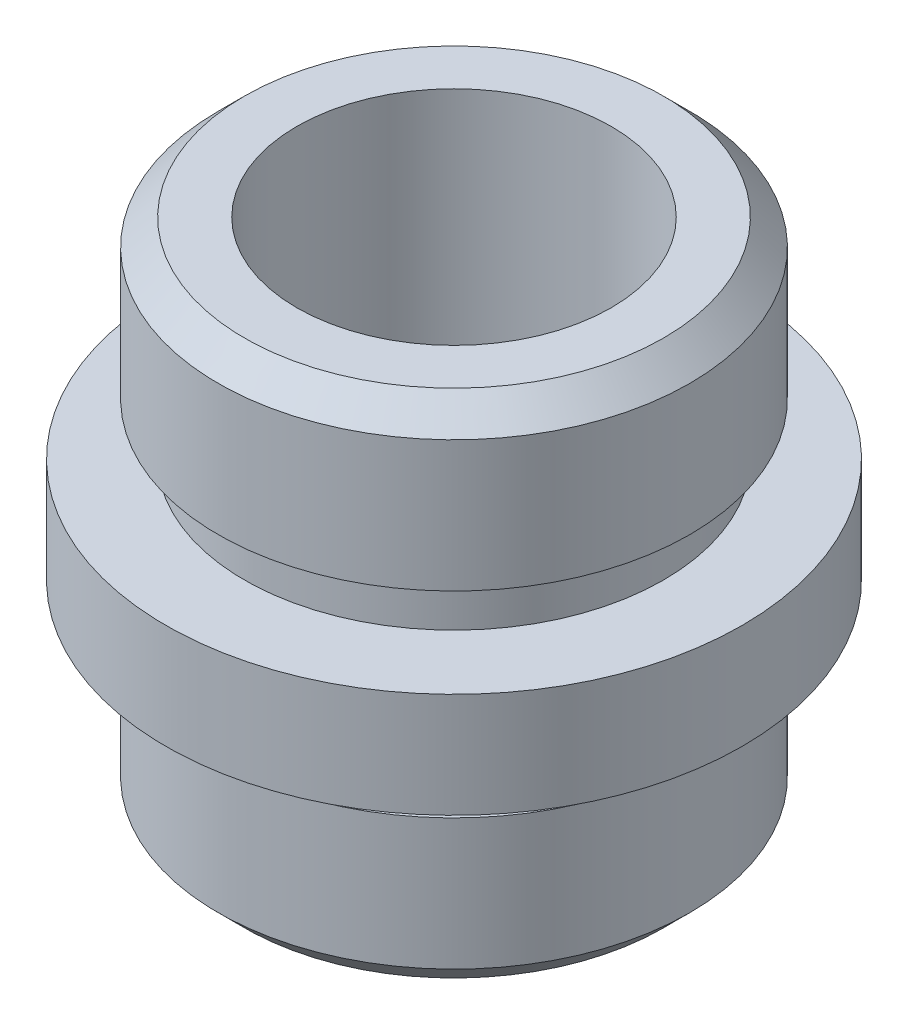
ISO-10303-21;
HEADER;
FILE_DESCRIPTION(('STEP AP214'),'2;1');
FILE_NAME('part.step','',(''),(''),'','','');
FILE_SCHEMA(('AUTOMOTIVE_DESIGN { 1 0 10303 214 1 1 1 1 }'));
ENDSEC;
DATA;
#1=APPLICATION_CONTEXT('core data for automotive mechanical design processes');
#2=APPLICATION_PROTOCOL_DEFINITION('international standard','automotive_design',2000,#1);
#3=PRODUCT_CONTEXT('',#1,'mechanical');
#4=PRODUCT('Part','Part','',(#3));
#5=PRODUCT_RELATED_PRODUCT_CATEGORY('part','',(#4));
#6=PRODUCT_DEFINITION_FORMATION('','',#4);
#7=PRODUCT_DEFINITION_CONTEXT('part definition',#1,'design');
#8=PRODUCT_DEFINITION('design','',#6,#7);
#9=PRODUCT_DEFINITION_SHAPE('','',#8);
#10=(LENGTH_UNIT() NAMED_UNIT(*) SI_UNIT(.MILLI.,.METRE.));
#11=(NAMED_UNIT(*) PLANE_ANGLE_UNIT() SI_UNIT($,.RADIAN.));
#12=(NAMED_UNIT(*) SI_UNIT($,.STERADIAN.) SOLID_ANGLE_UNIT());
#13=UNCERTAINTY_MEASURE_WITH_UNIT(LENGTH_MEASURE(1.E-05),#10,'distance_accuracy_value','');
#14=(GEOMETRIC_REPRESENTATION_CONTEXT(3) GLOBAL_UNCERTAINTY_ASSIGNED_CONTEXT((#13)) GLOBAL_UNIT_ASSIGNED_CONTEXT((#10,
#11,#12)) REPRESENTATION_CONTEXT('',''));
#15=CARTESIAN_POINT('',(0.,0.,0.));
#16=DIRECTION('',(0.,0.,1.));
#17=DIRECTION('',(1.,0.,0.));
#18=AXIS2_PLACEMENT_3D('',#15,#16,#17);
#19=CARTESIAN_POINT('',(-22.,0.,0.));
#20=DIRECTION('',(0.,1.,0.));
#21=DIRECTION('',(-1.,0.,0.));
#22=AXIS2_PLACEMENT_3D('',#19,#20,#21);
#23=PLANE('',#22);
#24=CARTESIAN_POINT('',(0.,0.,0.));
#25=DIRECTION('',(0.,1.,0.));
#26=DIRECTION('',(-1.,0.,0.));
#27=AXIS2_PLACEMENT_3D('',#24,#25,#26);
#28=CIRCLE('',#27,22.);
#29=CARTESIAN_POINT('',(-22.,0.,0.));
#30=VERTEX_POINT('',#29);
#31=EDGE_CURVE('E10',#30,#30,#28,.T.);
#32=ORIENTED_EDGE('',*,*,#31,.T.);
#33=EDGE_LOOP('',(#32));
#34=FACE_BOUND('',#33,.T.);
#35=CARTESIAN_POINT('',(0.,0.,0.));
#36=DIRECTION('',(0.,1.,0.));
#37=DIRECTION('',(-1.,0.,0.));
#38=AXIS2_PLACEMENT_3D('',#35,#36,#37);
#39=CIRCLE('',#38,16.);
#40=CARTESIAN_POINT('',(-16.,0.,0.));
#41=VERTEX_POINT('',#40);
#42=EDGE_CURVE('E83',#41,#41,#39,.T.);
#43=ORIENTED_EDGE('',*,*,#42,.F.);
#44=EDGE_LOOP('',(#43));
#45=FACE_BOUND('',#44,.T.);
#46=ADVANCED_FACE('F37',(#34,#45),#23,.T.);
#47=CARTESIAN_POINT('',(0.,26.9368083563489,0.));
#48=DIRECTION('',(0.,1.,0.));
#49=DIRECTION('',(-1.,0.,0.));
#50=AXIS2_PLACEMENT_3D('',#47,#48,#49);
#51=CYLINDRICAL_SURFACE('',#50,22.);
#52=CARTESIAN_POINT('',(0.,-7.99999999999999,0.));
#53=DIRECTION('',(0.,1.,0.));
#54=DIRECTION('',(-1.,0.,0.));
#55=AXIS2_PLACEMENT_3D('',#52,#53,#54);
#56=CIRCLE('',#55,22.);
#57=CARTESIAN_POINT('',(-22.,-8.,0.));
#58=VERTEX_POINT('',#57);
#59=EDGE_CURVE('E43',#58,#58,#56,.T.);
#60=ORIENTED_EDGE('',*,*,#59,.T.);
#61=EDGE_LOOP('',(#60));
#62=FACE_BOUND('',#61,.T.);
#63=ORIENTED_EDGE('',*,*,#31,.F.);
#64=EDGE_LOOP('',(#63));
#65=FACE_BOUND('',#64,.T.);
#66=ADVANCED_FACE('F91',(#62,#65),#51,.T.);
#67=CARTESIAN_POINT('',(-16.,-8.,0.));
#68=DIRECTION('',(0.,-1.,0.));
#69=DIRECTION('',(1.,0.,0.));
#70=AXIS2_PLACEMENT_3D('',#67,#68,#69);
#71=PLANE('',#70);
#72=CARTESIAN_POINT('',(0.,-7.99999999999999,0.));
#73=DIRECTION('',(0.,1.,0.));
#74=DIRECTION('',(-1.,0.,0.));
#75=AXIS2_PLACEMENT_3D('',#72,#73,#74);
#76=CIRCLE('',#75,16.);
#77=CARTESIAN_POINT('',(-16.,-8.,0.));
#78=VERTEX_POINT('',#77);
#79=EDGE_CURVE('E47',#78,#78,#76,.T.);
#80=ORIENTED_EDGE('',*,*,#79,.T.);
#81=EDGE_LOOP('',(#80));
#82=FACE_BOUND('',#81,.T.);
#83=ORIENTED_EDGE('',*,*,#59,.F.);
#84=EDGE_LOOP('',(#83));
#85=FACE_BOUND('',#84,.T.);
#86=ADVANCED_FACE('F95',(#82,#85),#71,.T.);
#87=CARTESIAN_POINT('',(0.,26.9368083563489,0.));
#88=DIRECTION('',(0.,1.,0.));
#89=DIRECTION('',(-1.,0.,0.));
#90=AXIS2_PLACEMENT_3D('',#87,#88,#89);
#91=CYLINDRICAL_SURFACE('',#90,16.);
#92=CARTESIAN_POINT('',(0.,-11.,0.));
#93=DIRECTION('',(0.,1.,0.));
#94=DIRECTION('',(-1.,0.,0.));
#95=AXIS2_PLACEMENT_3D('',#92,#93,#94);
#96=CIRCLE('',#95,16.);
#97=CARTESIAN_POINT('',(-16.,-11.,0.));
#98=VERTEX_POINT('',#97);
#99=EDGE_CURVE('E51',#98,#98,#96,.T.);
#100=ORIENTED_EDGE('',*,*,#99,.T.);
#101=EDGE_LOOP('',(#100));
#102=FACE_BOUND('',#101,.T.);
#103=ORIENTED_EDGE('',*,*,#79,.F.);
#104=EDGE_LOOP('',(#103));
#105=FACE_BOUND('',#104,.T.);
#106=ADVANCED_FACE('F99',(#102,#105),#91,.T.);
#107=CARTESIAN_POINT('',(-18.,-11.,0.));
#108=DIRECTION('',(0.,1.,0.));
#109=DIRECTION('',(-1.,0.,0.));
#110=AXIS2_PLACEMENT_3D('',#107,#108,#109);
#111=PLANE('',#110);
#112=CARTESIAN_POINT('',(0.,-11.,0.));
#113=DIRECTION('',(0.,1.,0.));
#114=DIRECTION('',(-1.,0.,0.));
#115=AXIS2_PLACEMENT_3D('',#112,#113,#114);
#116=CIRCLE('',#115,18.);
#117=CARTESIAN_POINT('',(-18.,-11.,0.));
#118=VERTEX_POINT('',#117);
#119=EDGE_CURVE('E56',#118,#118,#116,.T.);
#120=ORIENTED_EDGE('',*,*,#119,.T.);
#121=EDGE_LOOP('',(#120));
#122=FACE_BOUND('',#121,.T.);
#123=ORIENTED_EDGE('',*,*,#99,.F.);
#124=EDGE_LOOP('',(#123));
#125=FACE_BOUND('',#124,.T.);
#126=ADVANCED_FACE('F106',(#122,#125),#111,.T.);
#127=CARTESIAN_POINT('',(0.,26.9368083563489,0.));
#128=DIRECTION('',(0.,1.,0.));
#129=DIRECTION('',(-1.,0.,0.));
#130=AXIS2_PLACEMENT_3D('',#127,#128,#129);
#131=CYLINDRICAL_SURFACE('',#130,18.);
#132=CARTESIAN_POINT('',(0.,-21.,0.));
#133=DIRECTION('',(0.,1.,0.));
#134=DIRECTION('',(-1.,0.,0.));
#135=AXIS2_PLACEMENT_3D('',#132,#133,#134);
#136=CIRCLE('',#135,18.);
#137=CARTESIAN_POINT('',(-18.,-21.,0.));
#138=VERTEX_POINT('',#137);
#139=EDGE_CURVE('E59',#138,#138,#136,.T.);
#140=ORIENTED_EDGE('',*,*,#139,.T.);
#141=EDGE_LOOP('',(#140));
#142=FACE_BOUND('',#141,.T.);
#143=ORIENTED_EDGE('',*,*,#119,.F.);
#144=EDGE_LOOP('',(#143));
#145=FACE_BOUND('',#144,.T.);
#146=ADVANCED_FACE('F110',(#142,#145),#131,.T.);
#147=CARTESIAN_POINT('',(0.,-21.,0.));
#148=DIRECTION('',(0.,1.,0.));
#149=DIRECTION('',(-1.,0.,0.));
#150=AXIS2_PLACEMENT_3D('',#147,#148,#149);
#151=CONICAL_SURFACE('',#150,18.,0.785398163397447);
#152=CARTESIAN_POINT('',(0.,-23.,0.));
#153=DIRECTION('',(0.,1.,0.));
#154=DIRECTION('',(-1.,0.,0.));
#155=AXIS2_PLACEMENT_3D('',#152,#153,#154);
#156=CIRCLE('',#155,16.);
#157=CARTESIAN_POINT('',(-16.,-23.,0.));
#158=VERTEX_POINT('',#157);
#159=EDGE_CURVE('E62',#158,#158,#156,.T.);
#160=ORIENTED_EDGE('',*,*,#159,.T.);
#161=EDGE_LOOP('',(#160));
#162=FACE_BOUND('',#161,.T.);
#163=ORIENTED_EDGE('',*,*,#139,.F.);
#164=EDGE_LOOP('',(#163));
#165=FACE_BOUND('',#164,.T.);
#166=ADVANCED_FACE('F114',(#162,#165),#151,.T.);
#167=CARTESIAN_POINT('',(-12.,-23.,0.));
#168=DIRECTION('',(0.,-1.,0.));
#169=DIRECTION('',(1.,0.,0.));
#170=AXIS2_PLACEMENT_3D('',#167,#168,#169);
#171=PLANE('',#170);
#172=CARTESIAN_POINT('',(0.,-23.,0.));
#173=DIRECTION('',(0.,1.,0.));
#174=DIRECTION('',(-1.,0.,0.));
#175=AXIS2_PLACEMENT_3D('',#172,#173,#174);
#176=CIRCLE('',#175,12.);
#177=CARTESIAN_POINT('',(-12.,-23.,0.));
#178=VERTEX_POINT('',#177);
#179=EDGE_CURVE('E65',#178,#178,#176,.T.);
#180=ORIENTED_EDGE('',*,*,#179,.T.);
#181=EDGE_LOOP('',(#180));
#182=FACE_BOUND('',#181,.T.);
#183=ORIENTED_EDGE('',*,*,#159,.F.);
#184=EDGE_LOOP('',(#183));
#185=FACE_BOUND('',#184,.T.);
#186=ADVANCED_FACE('F118',(#182,#185),#171,.T.);
#187=CARTESIAN_POINT('',(0.,26.9368083563489,0.));
#188=DIRECTION('',(0.,1.,0.));
#189=DIRECTION('',(-1.,0.,0.));
#190=AXIS2_PLACEMENT_3D('',#187,#188,#189);
#191=CYLINDRICAL_SURFACE('',#190,12.);
#192=CARTESIAN_POINT('',(0.,16.,0.));
#193=DIRECTION('',(0.,1.,0.));
#194=DIRECTION('',(-1.,0.,0.));
#195=AXIS2_PLACEMENT_3D('',#192,#193,#194);
#196=CIRCLE('',#195,12.);
#197=CARTESIAN_POINT('',(-12.,16.,0.));
#198=VERTEX_POINT('',#197);
#199=EDGE_CURVE('E68',#198,#198,#196,.T.);
#200=ORIENTED_EDGE('',*,*,#199,.T.);
#201=EDGE_LOOP('',(#200));
#202=FACE_BOUND('',#201,.T.);
#203=ORIENTED_EDGE('',*,*,#179,.F.);
#204=EDGE_LOOP('',(#203));
#205=FACE_BOUND('',#204,.T.);
#206=ADVANCED_FACE('F122',(#202,#205),#191,.F.);
#207=CARTESIAN_POINT('',(-16.,16.,0.));
#208=DIRECTION('',(0.,1.,0.));
#209=DIRECTION('',(-1.,0.,0.));
#210=AXIS2_PLACEMENT_3D('',#207,#208,#209);
#211=PLANE('',#210);
#212=CARTESIAN_POINT('',(0.,16.,0.));
#213=DIRECTION('',(0.,1.,0.));
#214=DIRECTION('',(-1.,0.,0.));
#215=AXIS2_PLACEMENT_3D('',#212,#213,#214);
#216=CIRCLE('',#215,16.);
#217=CARTESIAN_POINT('',(-16.,16.,0.));
#218=VERTEX_POINT('',#217);
#219=EDGE_CURVE('E71',#218,#218,#216,.T.);
#220=ORIENTED_EDGE('',*,*,#219,.T.);
#221=EDGE_LOOP('',(#220));
#222=FACE_BOUND('',#221,.T.);
#223=ORIENTED_EDGE('',*,*,#199,.F.);
#224=EDGE_LOOP('',(#223));
#225=FACE_BOUND('',#224,.T.);
#226=ADVANCED_FACE('F126',(#222,#225),#211,.T.);
#227=CARTESIAN_POINT('',(0.,16.,0.));
#228=DIRECTION('',(0.,-1.,0.));
#229=DIRECTION('',(1.,0.,0.));
#230=AXIS2_PLACEMENT_3D('',#227,#228,#229);
#231=CONICAL_SURFACE('',#230,16.,0.785398163397447);
#232=CARTESIAN_POINT('',(0.,14.,0.));
#233=DIRECTION('',(0.,1.,0.));
#234=DIRECTION('',(-1.,0.,0.));
#235=AXIS2_PLACEMENT_3D('',#232,#233,#234);
#236=CIRCLE('',#235,18.);
#237=CARTESIAN_POINT('',(-18.,14.,0.));
#238=VERTEX_POINT('',#237);
#239=EDGE_CURVE('E74',#238,#238,#236,.T.);
#240=ORIENTED_EDGE('',*,*,#239,.T.);
#241=EDGE_LOOP('',(#240));
#242=FACE_BOUND('',#241,.T.);
#243=ORIENTED_EDGE('',*,*,#219,.F.);
#244=EDGE_LOOP('',(#243));
#245=FACE_BOUND('',#244,.T.);
#246=ADVANCED_FACE('F130',(#242,#245),#231,.T.);
#247=CARTESIAN_POINT('',(0.,26.9368083563489,0.));
#248=DIRECTION('',(0.,1.,0.));
#249=DIRECTION('',(-1.,0.,0.));
#250=AXIS2_PLACEMENT_3D('',#247,#248,#249);
#251=CYLINDRICAL_SURFACE('',#250,18.);
#252=CARTESIAN_POINT('',(0.,4.00000000000001,0.));
#253=DIRECTION('',(0.,1.,0.));
#254=DIRECTION('',(-1.,0.,0.));
#255=AXIS2_PLACEMENT_3D('',#252,#253,#254);
#256=CIRCLE('',#255,18.);
#257=CARTESIAN_POINT('',(-18.,4.,0.));
#258=VERTEX_POINT('',#257);
#259=EDGE_CURVE('E77',#258,#258,#256,.T.);
#260=ORIENTED_EDGE('',*,*,#259,.T.);
#261=EDGE_LOOP('',(#260));
#262=FACE_BOUND('',#261,.T.);
#263=ORIENTED_EDGE('',*,*,#239,.F.);
#264=EDGE_LOOP('',(#263));
#265=FACE_BOUND('',#264,.T.);
#266=ADVANCED_FACE('F134',(#262,#265),#251,.T.);
#267=CARTESIAN_POINT('',(-16.,4.,0.));
#268=DIRECTION('',(0.,-1.,0.));
#269=DIRECTION('',(1.,0.,0.));
#270=AXIS2_PLACEMENT_3D('',#267,#268,#269);
#271=PLANE('',#270);
#272=CARTESIAN_POINT('',(0.,4.,0.));
#273=DIRECTION('',(0.,1.,0.));
#274=DIRECTION('',(-1.,0.,0.));
#275=AXIS2_PLACEMENT_3D('',#272,#273,#274);
#276=CIRCLE('',#275,16.);
#277=CARTESIAN_POINT('',(-16.,4.,0.));
#278=VERTEX_POINT('',#277);
#279=EDGE_CURVE('E80',#278,#278,#276,.T.);
#280=ORIENTED_EDGE('',*,*,#279,.T.);
#281=EDGE_LOOP('',(#280));
#282=FACE_BOUND('',#281,.T.);
#283=ORIENTED_EDGE('',*,*,#259,.F.);
#284=EDGE_LOOP('',(#283));
#285=FACE_BOUND('',#284,.T.);
#286=ADVANCED_FACE('F138',(#282,#285),#271,.T.);
#287=CARTESIAN_POINT('',(0.,26.9368083563489,0.));
#288=DIRECTION('',(0.,1.,0.));
#289=DIRECTION('',(-1.,0.,0.));
#290=AXIS2_PLACEMENT_3D('',#287,#288,#289);
#291=CYLINDRICAL_SURFACE('',#290,16.);
#292=ORIENTED_EDGE('',*,*,#42,.T.);
#293=EDGE_LOOP('',(#292));
#294=FACE_BOUND('',#293,.T.);
#295=ORIENTED_EDGE('',*,*,#279,.F.);
#296=EDGE_LOOP('',(#295));
#297=FACE_BOUND('',#296,.T.);
#298=ADVANCED_FACE('F87',(#294,#297),#291,.T.);
#299=CLOSED_SHELL('',(#46,#66,#86,#106,#126,#146,#166,#186,#206,#226,#246,#266,#286,#298));
#300=MANIFOLD_SOLID_BREP('B2',#299);
#301=ADVANCED_BREP_SHAPE_REPRESENTATION('',(#18,#300),#14);
#302=SHAPE_DEFINITION_REPRESENTATION(#9,#301);
ENDSEC;
END-ISO-10303-21;
